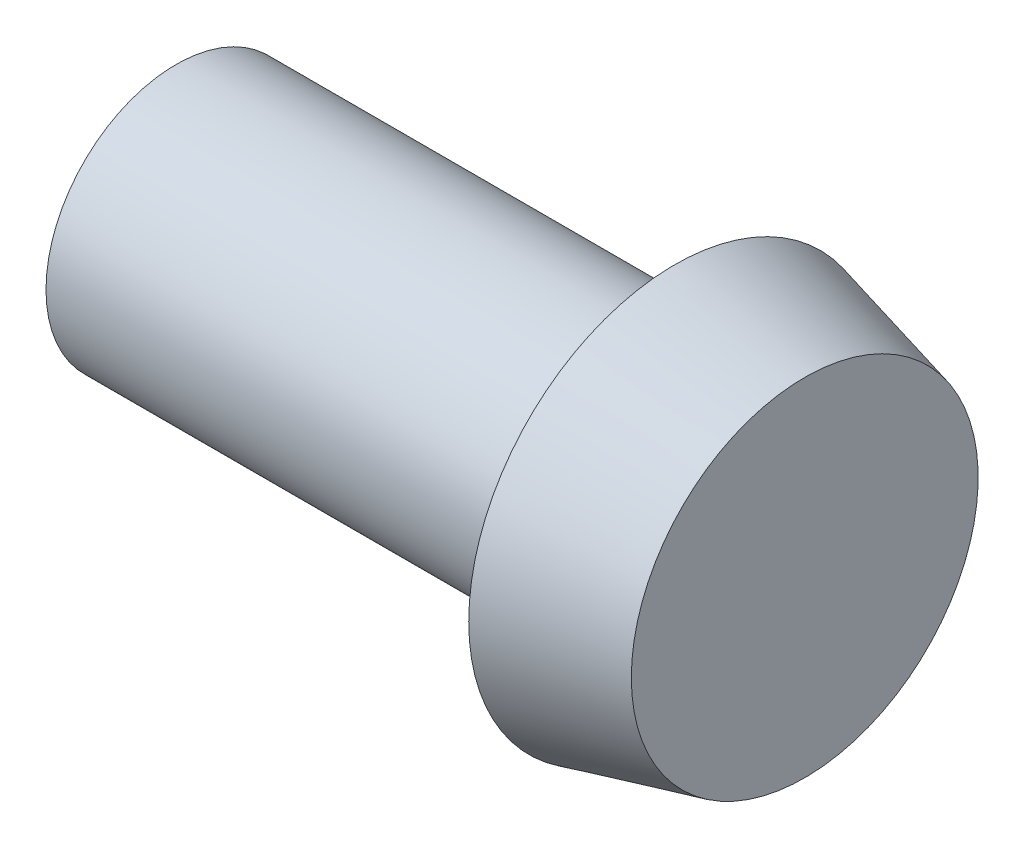
ISO-10303-21;
HEADER;
FILE_DESCRIPTION(('STEP AP214'),'2;1');
FILE_NAME('part.step','',(''),(''),'','','');
FILE_SCHEMA(('AUTOMOTIVE_DESIGN { 1 0 10303 214 1 1 1 1 }'));
ENDSEC;
DATA;
#1=APPLICATION_CONTEXT('core data for automotive mechanical design processes');
#2=APPLICATION_PROTOCOL_DEFINITION('international standard','automotive_design',2000,#1);
#3=PRODUCT_CONTEXT('',#1,'mechanical');
#4=PRODUCT('Part','Part','',(#3));
#5=PRODUCT_RELATED_PRODUCT_CATEGORY('part','',(#4));
#6=PRODUCT_DEFINITION_FORMATION('','',#4);
#7=PRODUCT_DEFINITION_CONTEXT('part definition',#1,'design');
#8=PRODUCT_DEFINITION('design','',#6,#7);
#9=PRODUCT_DEFINITION_SHAPE('','',#8);
#10=(LENGTH_UNIT() NAMED_UNIT(*) SI_UNIT(.MILLI.,.METRE.));
#11=(NAMED_UNIT(*) PLANE_ANGLE_UNIT() SI_UNIT($,.RADIAN.));
#12=(NAMED_UNIT(*) SI_UNIT($,.STERADIAN.) SOLID_ANGLE_UNIT());
#13=UNCERTAINTY_MEASURE_WITH_UNIT(LENGTH_MEASURE(1.E-05),#10,'distance_accuracy_value','');
#14=(GEOMETRIC_REPRESENTATION_CONTEXT(3) GLOBAL_UNCERTAINTY_ASSIGNED_CONTEXT((#13)) GLOBAL_UNIT_ASSIGNED_CONTEXT((#10,
#11,#12)) REPRESENTATION_CONTEXT('',''));
#15=CARTESIAN_POINT('',(0.,0.,0.));
#16=DIRECTION('',(0.,0.,1.));
#17=DIRECTION('',(1.,0.,0.));
#18=AXIS2_PLACEMENT_3D('',#15,#16,#17);
#19=CARTESIAN_POINT('',(6.,0.,0.));
#20=DIRECTION('',(-1.,0.,0.));
#21=DIRECTION('',(0.,0.,1.));
#22=AXIS2_PLACEMENT_3D('',#19,#20,#21);
#23=PLANE('',#22);
#24=CARTESIAN_POINT('',(6.,0.,0.));
#25=DIRECTION('',(-1.,0.,0.));
#26=DIRECTION('',(0.,0.,1.));
#27=AXIS2_PLACEMENT_3D('',#24,#25,#26);
#28=CIRCLE('',#27,8.);
#29=CARTESIAN_POINT('',(6.,0.,8.));
#30=VERTEX_POINT('',#29);
#31=EDGE_CURVE('E10',#30,#30,#28,.T.);
#32=ORIENTED_EDGE('',*,*,#31,.F.);
#33=EDGE_LOOP('',(#32));
#34=FACE_BOUND('',#33,.T.);
#35=ADVANCED_FACE('F43',(#34),#23,.F.);
#36=CARTESIAN_POINT('',(0.,0.,0.));
#37=DIRECTION('',(-1.,0.,0.));
#38=DIRECTION('',(0.,0.,1.));
#39=AXIS2_PLACEMENT_3D('',#36,#37,#38);
#40=CONICAL_SURFACE('',#39,9.5,0.244978663126864);
#41=ORIENTED_EDGE('',*,*,#31,.T.);
#42=EDGE_LOOP('',(#41));
#43=FACE_BOUND('',#42,.T.);
#44=CARTESIAN_POINT('',(0.,0.,0.));
#45=DIRECTION('',(-1.,0.,0.));
#46=DIRECTION('',(0.,0.,1.));
#47=AXIS2_PLACEMENT_3D('',#44,#45,#46);
#48=CIRCLE('',#47,9.5);
#49=CARTESIAN_POINT('',(0.,0.,9.5));
#50=VERTEX_POINT('',#49);
#51=EDGE_CURVE('E49',#50,#50,#48,.T.);
#52=ORIENTED_EDGE('',*,*,#51,.F.);
#53=EDGE_LOOP('',(#52));
#54=FACE_BOUND('',#53,.T.);
#55=ADVANCED_FACE('F73',(#43,#54),#40,.T.);
#56=CARTESIAN_POINT('',(0.,0.,-6.));
#57=DIRECTION('',(-1.,0.,0.));
#58=DIRECTION('',(0.,0.,1.));
#59=AXIS2_PLACEMENT_3D('',#56,#57,#58);
#60=PLANE('',#59);
#61=ORIENTED_EDGE('',*,*,#51,.T.);
#62=EDGE_LOOP('',(#61));
#63=FACE_BOUND('',#62,.T.);
#64=CARTESIAN_POINT('',(0.,0.,0.));
#65=DIRECTION('',(-1.,0.,0.));
#66=DIRECTION('',(0.,0.,1.));
#67=AXIS2_PLACEMENT_3D('',#64,#65,#66);
#68=CIRCLE('',#67,6.);
#69=CARTESIAN_POINT('',(0.,0.,6.));
#70=VERTEX_POINT('',#69);
#71=EDGE_CURVE('E53',#70,#70,#68,.T.);
#72=ORIENTED_EDGE('',*,*,#71,.F.);
#73=EDGE_LOOP('',(#72));
#74=FACE_BOUND('',#73,.T.);
#75=ADVANCED_FACE('F68',(#63,#74),#60,.T.);
#76=CARTESIAN_POINT('',(-30.4649804457564,0.,0.));
#77=DIRECTION('',(-1.,0.,0.));
#78=DIRECTION('',(0.,0.,1.));
#79=AXIS2_PLACEMENT_3D('',#76,#77,#78);
#80=CYLINDRICAL_SURFACE('',#79,6.);
#81=CARTESIAN_POINT('',(-23.,0.,0.));
#82=DIRECTION('',(-1.,0.,0.));
#83=DIRECTION('',(0.,0.,1.));
#84=AXIS2_PLACEMENT_3D('',#81,#82,#83);
#85=CIRCLE('',#84,6.);
#86=CARTESIAN_POINT('',(-23.,0.,6.));
#87=VERTEX_POINT('',#86);
#88=EDGE_CURVE('E57',#87,#87,#85,.T.);
#89=ORIENTED_EDGE('',*,*,#88,.F.);
#90=EDGE_LOOP('',(#89));
#91=FACE_BOUND('',#90,.T.);
#92=ORIENTED_EDGE('',*,*,#71,.T.);
#93=EDGE_LOOP('',(#92));
#94=FACE_BOUND('',#93,.T.);
#95=ADVANCED_FACE('F65',(#91,#94),#80,.T.);
#96=CARTESIAN_POINT('',(-23.,0.,-6.));
#97=DIRECTION('',(1.,0.,0.));
#98=DIRECTION('',(0.,0.,-1.));
#99=AXIS2_PLACEMENT_3D('',#96,#97,#98);
#100=PLANE('',#99);
#101=ORIENTED_EDGE('',*,*,#88,.T.);
#102=EDGE_LOOP('',(#101));
#103=FACE_BOUND('',#102,.T.);
#104=ADVANCED_FACE('F63',(#103),#100,.F.);
#105=CLOSED_SHELL('',(#35,#55,#75,#95,#104));
#106=MANIFOLD_SOLID_BREP('B2',#105);
#107=ADVANCED_BREP_SHAPE_REPRESENTATION('',(#18,#106),#14);
#108=SHAPE_DEFINITION_REPRESENTATION(#9,#107);
ENDSEC;
END-ISO-10303-21;
